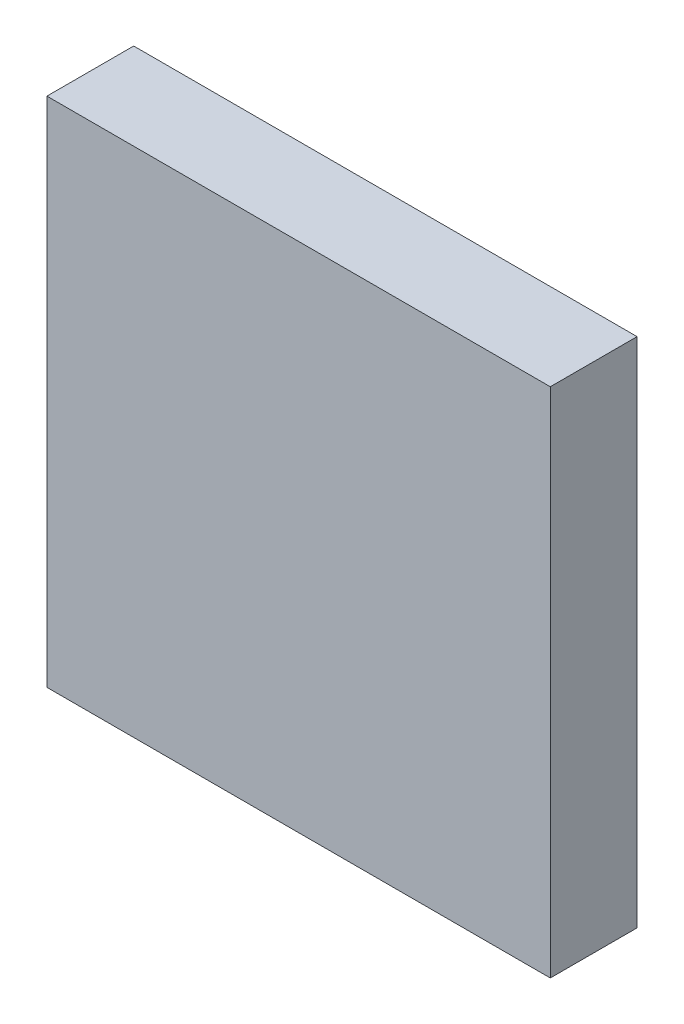
ISO-10303-21;
HEADER;
FILE_DESCRIPTION(('STEP AP214'),'2;1');
FILE_NAME('part.step','',(''),(''),'','','');
FILE_SCHEMA(('AUTOMOTIVE_DESIGN { 1 0 10303 214 1 1 1 1 }'));
ENDSEC;
DATA;
#1=APPLICATION_CONTEXT('core data for automotive mechanical design processes');
#2=APPLICATION_PROTOCOL_DEFINITION('international standard','automotive_design',2000,#1);
#3=PRODUCT_CONTEXT('',#1,'mechanical');
#4=PRODUCT('Part','Part','',(#3));
#5=PRODUCT_RELATED_PRODUCT_CATEGORY('part','',(#4));
#6=PRODUCT_DEFINITION_FORMATION('','',#4);
#7=PRODUCT_DEFINITION_CONTEXT('part definition',#1,'design');
#8=PRODUCT_DEFINITION('design','',#6,#7);
#9=PRODUCT_DEFINITION_SHAPE('','',#8);
#10=(LENGTH_UNIT() NAMED_UNIT(*) SI_UNIT(.MILLI.,.METRE.));
#11=(NAMED_UNIT(*) PLANE_ANGLE_UNIT() SI_UNIT($,.RADIAN.));
#12=(NAMED_UNIT(*) SI_UNIT($,.STERADIAN.) SOLID_ANGLE_UNIT());
#13=UNCERTAINTY_MEASURE_WITH_UNIT(LENGTH_MEASURE(1.E-05),#10,'distance_accuracy_value','');
#14=(GEOMETRIC_REPRESENTATION_CONTEXT(3) GLOBAL_UNCERTAINTY_ASSIGNED_CONTEXT((#13)) GLOBAL_UNIT_ASSIGNED_CONTEXT((#10,
#11,#12)) REPRESENTATION_CONTEXT('',''));
#15=CARTESIAN_POINT('',(0.,0.,0.));
#16=DIRECTION('',(0.,0.,1.));
#17=DIRECTION('',(1.,0.,0.));
#18=AXIS2_PLACEMENT_3D('',#15,#16,#17);
#19=CARTESIAN_POINT('',(27.1539804993036,-40.3300653594771,10.));
#20=DIRECTION('',(-1.,0.,0.));
#21=DIRECTION('',(0.,0.,1.));
#22=AXIS2_PLACEMENT_3D('',#19,#20,#21);
#23=PLANE('',#22);
#24=DIRECTION('',(0.,1.,0.));
#25=VECTOR('',#24,1.);
#26=CARTESIAN_POINT('',(27.1539804993036,-40.3300653594771,0.));
#27=LINE('',#26,#25);
#28=CARTESIAN_POINT('',(27.1539804993036,-40.3300653594771,0.));
#29=VERTEX_POINT('',#28);
#30=CARTESIAN_POINT('',(27.1539804993036,18.6699346405229,0.));
#31=VERTEX_POINT('',#30);
#32=EDGE_CURVE('E96',#29,#31,#27,.T.);
#33=ORIENTED_EDGE('',*,*,#32,.T.);
#34=DIRECTION('',(0.,0.,-1.));
#35=VECTOR('',#34,1.);
#36=CARTESIAN_POINT('',(27.1539804993036,18.6699346405229,10.));
#37=LINE('',#36,#35);
#38=CARTESIAN_POINT('',(27.1539804993036,18.6699346405229,10.));
#39=VERTEX_POINT('',#38);
#40=EDGE_CURVE('E11',#39,#31,#37,.T.);
#41=ORIENTED_EDGE('',*,*,#40,.F.);
#42=DIRECTION('',(0.,1.,0.));
#43=VECTOR('',#42,1.);
#44=CARTESIAN_POINT('',(27.1539804993036,-40.3300653594771,10.));
#45=LINE('',#44,#43);
#46=CARTESIAN_POINT('',(27.1539804993036,-40.3300653594771,10.));
#47=VERTEX_POINT('',#46);
#48=EDGE_CURVE('E84',#47,#39,#45,.T.);
#49=ORIENTED_EDGE('',*,*,#48,.F.);
#50=DIRECTION('',(0.,0.,-1.));
#51=VECTOR('',#50,1.);
#52=CARTESIAN_POINT('',(27.1539804993036,-40.3300653594771,10.));
#53=LINE('',#52,#51);
#54=EDGE_CURVE('E92',#47,#29,#53,.T.);
#55=ORIENTED_EDGE('',*,*,#54,.T.);
#56=EDGE_LOOP('',(#33,#41,#49,#55));
#57=FACE_BOUND('',#56,.T.);
#58=ADVANCED_FACE('F33',(#57),#23,.F.);
#59=CARTESIAN_POINT('',(27.1539804993036,18.6699346405229,10.));
#60=DIRECTION('',(0.,-1.,0.));
#61=DIRECTION('',(0.,0.,-1.));
#62=AXIS2_PLACEMENT_3D('',#59,#60,#61);
#63=PLANE('',#62);
#64=DIRECTION('',(-1.,0.,0.));
#65=VECTOR('',#64,1.);
#66=CARTESIAN_POINT('',(27.1539804993036,18.6699346405229,0.));
#67=LINE('',#66,#65);
#68=CARTESIAN_POINT('',(-30.8460195006964,18.6699346405229,0.));
#69=VERTEX_POINT('',#68);
#70=EDGE_CURVE('E88',#31,#69,#67,.T.);
#71=ORIENTED_EDGE('',*,*,#70,.T.);
#72=DIRECTION('',(0.,0.,-1.));
#73=VECTOR('',#72,1.);
#74=CARTESIAN_POINT('',(-30.8460195006964,18.6699346405229,10.));
#75=LINE('',#74,#73);
#76=CARTESIAN_POINT('',(-30.8460195006964,18.6699346405229,10.));
#77=VERTEX_POINT('',#76);
#78=EDGE_CURVE('E41',#77,#69,#75,.T.);
#79=ORIENTED_EDGE('',*,*,#78,.F.);
#80=DIRECTION('',(-1.,0.,0.));
#81=VECTOR('',#80,1.);
#82=CARTESIAN_POINT('',(27.1539804993036,18.6699346405229,10.));
#83=LINE('',#82,#81);
#84=EDGE_CURVE('E79',#39,#77,#83,.T.);
#85=ORIENTED_EDGE('',*,*,#84,.F.);
#86=ORIENTED_EDGE('',*,*,#40,.T.);
#87=EDGE_LOOP('',(#71,#79,#85,#86));
#88=FACE_BOUND('',#87,.T.);
#89=ADVANCED_FACE('F87',(#88),#63,.F.);
#90=CARTESIAN_POINT('',(-30.8460195006964,-40.3300653594771,10.));
#91=DIRECTION('',(1.,0.,0.));
#92=DIRECTION('',(0.,1.,0.));
#93=AXIS2_PLACEMENT_3D('',#90,#91,#92);
#94=PLANE('',#93);
#95=DIRECTION('',(0.,-1.,0.));
#96=VECTOR('',#95,1.);
#97=CARTESIAN_POINT('',(-30.8460195006964,-40.3300653594771,0.));
#98=LINE('',#97,#96);
#99=CARTESIAN_POINT('',(-30.8460195006964,-40.3300653594771,0.));
#100=VERTEX_POINT('',#99);
#101=EDGE_CURVE('E66',#69,#100,#98,.T.);
#102=ORIENTED_EDGE('',*,*,#101,.T.);
#103=DIRECTION('',(0.,0.,-1.));
#104=VECTOR('',#103,1.);
#105=CARTESIAN_POINT('',(-30.8460195006964,-40.3300653594771,10.));
#106=LINE('',#105,#104);
#107=CARTESIAN_POINT('',(-30.8460195006964,-40.3300653594771,10.));
#108=VERTEX_POINT('',#107);
#109=EDGE_CURVE('E89',#108,#100,#106,.T.);
#110=ORIENTED_EDGE('',*,*,#109,.F.);
#111=DIRECTION('',(0.,-1.,0.));
#112=VECTOR('',#111,1.);
#113=CARTESIAN_POINT('',(-30.8460195006964,-40.3300653594771,10.));
#114=LINE('',#113,#112);
#115=EDGE_CURVE('E82',#77,#108,#114,.T.);
#116=ORIENTED_EDGE('',*,*,#115,.F.);
#117=ORIENTED_EDGE('',*,*,#78,.T.);
#118=EDGE_LOOP('',(#102,#110,#116,#117));
#119=FACE_BOUND('',#118,.T.);
#120=ADVANCED_FACE('F90',(#119),#94,.F.);
#121=CARTESIAN_POINT('',(27.1539804993036,-40.3300653594771,10.));
#122=DIRECTION('',(0.,1.,0.));
#123=DIRECTION('',(-1.,0.,0.));
#124=AXIS2_PLACEMENT_3D('',#121,#122,#123);
#125=PLANE('',#124);
#126=DIRECTION('',(1.,0.,0.));
#127=VECTOR('',#126,1.);
#128=CARTESIAN_POINT('',(27.1539804993036,-40.3300653594771,0.));
#129=LINE('',#128,#127);
#130=EDGE_CURVE('E72',#100,#29,#129,.T.);
#131=ORIENTED_EDGE('',*,*,#130,.T.);
#132=ORIENTED_EDGE('',*,*,#54,.F.);
#133=DIRECTION('',(1.,0.,0.));
#134=VECTOR('',#133,1.);
#135=CARTESIAN_POINT('',(27.1539804993036,-40.3300653594771,10.));
#136=LINE('',#135,#134);
#137=EDGE_CURVE('E49',#108,#47,#136,.T.);
#138=ORIENTED_EDGE('',*,*,#137,.F.);
#139=ORIENTED_EDGE('',*,*,#109,.T.);
#140=EDGE_LOOP('',(#131,#132,#138,#139));
#141=FACE_BOUND('',#140,.T.);
#142=ADVANCED_FACE('F103',(#141),#125,.F.);
#143=CARTESIAN_POINT('',(0.,0.,10.));
#144=DIRECTION('',(0.,0.,1.));
#145=DIRECTION('',(1.,0.,0.));
#146=AXIS2_PLACEMENT_3D('',#143,#144,#145);
#147=PLANE('',#146);
#148=ORIENTED_EDGE('',*,*,#48,.T.);
#149=ORIENTED_EDGE('',*,*,#84,.T.);
#150=ORIENTED_EDGE('',*,*,#115,.T.);
#151=ORIENTED_EDGE('',*,*,#137,.T.);
#152=EDGE_LOOP('',(#148,#149,#150,#151));
#153=FACE_BOUND('',#152,.T.);
#154=ADVANCED_FACE('F80',(#153),#147,.T.);
#155=CARTESIAN_POINT('',(0.,0.,0.));
#156=DIRECTION('',(0.,0.,1.));
#157=DIRECTION('',(1.,0.,0.));
#158=AXIS2_PLACEMENT_3D('',#155,#156,#157);
#159=PLANE('',#158);
#160=ORIENTED_EDGE('',*,*,#32,.F.);
#161=ORIENTED_EDGE('',*,*,#130,.F.);
#162=ORIENTED_EDGE('',*,*,#101,.F.);
#163=ORIENTED_EDGE('',*,*,#70,.F.);
#164=EDGE_LOOP('',(#160,#161,#162,#163));
#165=FACE_BOUND('',#164,.T.);
#166=ADVANCED_FACE('F106',(#165),#159,.F.);
#167=CLOSED_SHELL('',(#58,#89,#120,#142,#154,#166));
#168=MANIFOLD_SOLID_BREP('B2',#167);
#169=ADVANCED_BREP_SHAPE_REPRESENTATION('',(#18,#168),#14);
#170=SHAPE_DEFINITION_REPRESENTATION(#9,#169);
ENDSEC;
END-ISO-10303-21;
